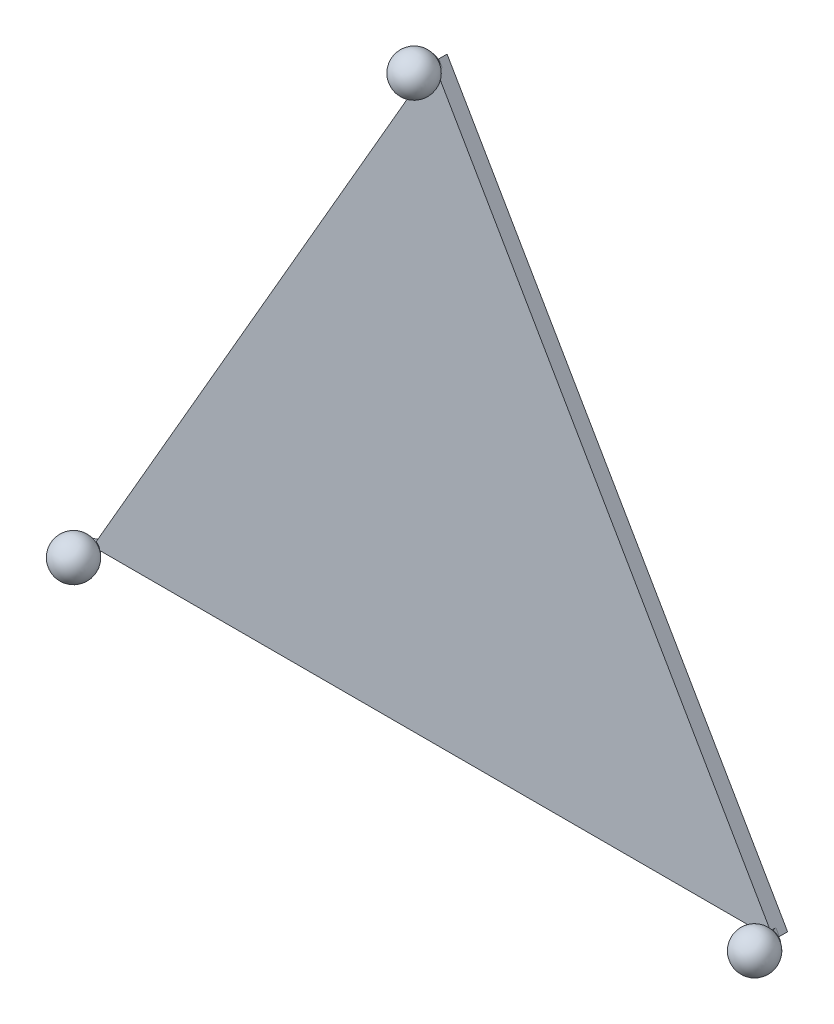
ISO-10303-21;
HEADER;
FILE_DESCRIPTION(('STEP AP214'),'2;1');
FILE_NAME('part.step','',(''),(''),'','','');
FILE_SCHEMA(('AUTOMOTIVE_DESIGN { 1 0 10303 214 1 1 1 1 }'));
ENDSEC;
DATA;
#1=APPLICATION_CONTEXT('core data for automotive mechanical design processes');
#2=APPLICATION_PROTOCOL_DEFINITION('international standard','automotive_design',2000,#1);
#3=PRODUCT_CONTEXT('',#1,'mechanical');
#4=PRODUCT('Part','Part','',(#3));
#5=PRODUCT_RELATED_PRODUCT_CATEGORY('part','',(#4));
#6=PRODUCT_DEFINITION_FORMATION('','',#4);
#7=PRODUCT_DEFINITION_CONTEXT('part definition',#1,'design');
#8=PRODUCT_DEFINITION('design','',#6,#7);
#9=PRODUCT_DEFINITION_SHAPE('','',#8);
#10=(LENGTH_UNIT() NAMED_UNIT(*) SI_UNIT(.MILLI.,.METRE.));
#11=(NAMED_UNIT(*) PLANE_ANGLE_UNIT() SI_UNIT($,.RADIAN.));
#12=(NAMED_UNIT(*) SI_UNIT($,.STERADIAN.) SOLID_ANGLE_UNIT());
#13=UNCERTAINTY_MEASURE_WITH_UNIT(LENGTH_MEASURE(1.E-05),#10,'distance_accuracy_value','');
#14=(GEOMETRIC_REPRESENTATION_CONTEXT(3) GLOBAL_UNCERTAINTY_ASSIGNED_CONTEXT((#13)) GLOBAL_UNIT_ASSIGNED_CONTEXT((#10,
#11,#12)) REPRESENTATION_CONTEXT('',''));
#15=CARTESIAN_POINT('',(0.,0.,0.));
#16=DIRECTION('',(0.,0.,1.));
#17=DIRECTION('',(1.,0.,0.));
#18=AXIS2_PLACEMENT_3D('',#15,#16,#17);
#19=CARTESIAN_POINT('',(-123.7575,-71.4514259392352,5.));
#20=DIRECTION('',(0.,0.,1.));
#21=DIRECTION('',(1.,0.,0.));
#22=AXIS2_PLACEMENT_3D('',#19,#20,#21);
#23=PLANE('',#22);
#24=CARTESIAN_POINT('',(-123.7575,-71.4514259392352,5.));
#25=DIRECTION('',(0.,0.,1.));
#26=DIRECTION('',(1.,0.,0.));
#27=AXIS2_PLACEMENT_3D('',#24,#25,#26);
#28=CIRCLE('',#27,2.5);
#29=CARTESIAN_POINT('',(-124.739550807569,-69.1523878335585,5.));
#30=VERTEX_POINT('',#29);
#31=CARTESIAN_POINT('',(-126.239550807569,-71.7504640449118,5.));
#32=VERTEX_POINT('',#31);
#33=EDGE_CURVE('E379',#30,#32,#28,.T.);
#34=ORIENTED_EDGE('',*,*,#33,.F.);
#35=DIRECTION('',(-0.5,-0.866025403784439,0.));
#36=VECTOR('',#35,1.);
#37=CARTESIAN_POINT('',(-125.489550807569,-70.4514259392352,5.));
#38=LINE('',#37,#36);
#39=EDGE_CURVE('E289',#30,#32,#38,.T.);
#40=ORIENTED_EDGE('',*,*,#39,.T.);
#41=EDGE_LOOP('',(#34,#40));
#42=FACE_BOUND('',#41,.T.);
#43=ADVANCED_FACE('F33',(#42),#23,.F.);
#44=CARTESIAN_POINT('',(0.,142.90285187847,5.));
#45=DIRECTION('',(0.,0.,1.));
#46=DIRECTION('',(1.,0.,0.));
#47=AXIS2_PLACEMENT_3D('',#44,#45,#46);
#48=PLANE('',#47);
#49=CARTESIAN_POINT('',(0.,142.90285187847,5.));
#50=DIRECTION('',(0.,0.,1.));
#51=DIRECTION('',(1.,0.,0.));
#52=AXIS2_PLACEMENT_3D('',#49,#50,#51);
#53=CIRCLE('',#52,2.5);
#54=CARTESIAN_POINT('',(2.48205080756888,142.603813772794,5.));
#55=VERTEX_POINT('',#54);
#56=CARTESIAN_POINT('',(0.982050807568891,145.201889984147,5.));
#57=VERTEX_POINT('',#56);
#58=EDGE_CURVE('E384',#55,#57,#53,.T.);
#59=ORIENTED_EDGE('',*,*,#58,.F.);
#60=DIRECTION('',(-0.5,0.866025403784439,0.));
#61=VECTOR('',#60,1.);
#62=CARTESIAN_POINT('',(1.73205080756889,143.90285187847,5.));
#63=LINE('',#62,#61);
#64=EDGE_CURVE('E271',#55,#57,#63,.T.);
#65=ORIENTED_EDGE('',*,*,#64,.T.);
#66=EDGE_LOOP('',(#59,#65));
#67=FACE_BOUND('',#66,.T.);
#68=ADVANCED_FACE('F397',(#67),#48,.F.);
#69=CARTESIAN_POINT('',(123.7575,-71.451425939235,5.));
#70=DIRECTION('',(0.,0.,1.));
#71=DIRECTION('',(1.,0.,0.));
#72=AXIS2_PLACEMENT_3D('',#69,#70,#71);
#73=PLANE('',#72);
#74=CARTESIAN_POINT('',(123.7575,-71.451425939235,5.));
#75=DIRECTION('',(0.,0.,1.));
#76=DIRECTION('',(1.,0.,0.));
#77=AXIS2_PLACEMENT_3D('',#74,#75,#76);
#78=CIRCLE('',#77,2.5);
#79=CARTESIAN_POINT('',(126.239550807569,-71.7504640449117,5.));
#80=VERTEX_POINT('',#79);
#81=CARTESIAN_POINT('',(124.739550807569,-69.1523878335584,5.));
#82=VERTEX_POINT('',#81);
#83=EDGE_CURVE('E176',#80,#82,#78,.T.);
#84=ORIENTED_EDGE('',*,*,#83,.F.);
#85=DIRECTION('',(-0.5,0.866025403784439,0.));
#86=VECTOR('',#85,1.);
#87=CARTESIAN_POINT('',(124.239550807569,-68.2863624297739,5.));
#88=LINE('',#87,#86);
#89=EDGE_CURVE('E213',#80,#82,#88,.T.);
#90=ORIENTED_EDGE('',*,*,#89,.T.);
#91=EDGE_LOOP('',(#84,#90));
#92=FACE_BOUND('',#91,.T.);
#93=ADVANCED_FACE('F352',(#92),#73,.F.);
#94=CARTESIAN_POINT('',(-123.7575,-71.4514259392352,12.));
#95=DIRECTION('',(0.,0.,-1.));
#96=DIRECTION('',(-1.,0.,0.));
#97=AXIS2_PLACEMENT_3D('',#94,#95,#96);
#98=CYLINDRICAL_SURFACE('',#97,2.5);
#99=CARTESIAN_POINT('',(-121.2575,-71.4514259392352,5.));
#100=VERTEX_POINT('',#99);
#101=CARTESIAN_POINT('',(-122.5075,-69.2863624297741,5.));
#102=VERTEX_POINT('',#101);
#103=EDGE_CURVE('E179',#100,#102,#28,.T.);
#104=ORIENTED_EDGE('',*,*,#103,.T.);
#105=DIRECTION('',(0.,0.,-1.));
#106=VECTOR('',#105,1.);
#107=CARTESIAN_POINT('',(-122.5075,-69.2863624297741,3.));
#108=LINE('',#107,#106);
#109=CARTESIAN_POINT('',(-122.5075,-69.2863624297741,3.));
#110=VERTEX_POINT('',#109);
#111=EDGE_CURVE('E279',#110,#102,#108,.F.);
#112=ORIENTED_EDGE('',*,*,#111,.F.);
#113=CARTESIAN_POINT('',(-122.5075,-69.2863624297741,3.));
#114=CARTESIAN_POINT('',(-122.507502372517,-69.2863769555669,3.05588403656606));
#115=CARTESIAN_POINT('',(-122.509528639529,-69.2851916023864,3.11176548566042));
#116=CARTESIAN_POINT('',(-122.517644088464,-69.2805281048706,3.22313523949123));
#117=CARTESIAN_POINT('',(-122.523733185758,-69.2770500082925,3.27862355239221));
#118=CARTESIAN_POINT('',(-122.539996250077,-69.2679041414412,3.38886772437637));
#119=CARTESIAN_POINT('',(-122.550173645324,-69.2622345336382,3.44362292879691));
#120=CARTESIAN_POINT('',(-122.574630446917,-69.2489247868919,3.55194850490367));
#121=CARTESIAN_POINT('',(-122.588909801746,-69.2412846726967,3.60551889146111));
#122=CARTESIAN_POINT('',(-122.637985752196,-69.2157891418292,3.76397748741582));
#123=CARTESIAN_POINT('',(-122.679020686936,-69.1953582514509,3.86661627898835));
#124=CARTESIAN_POINT('',(-122.777804146591,-69.1507497225796,4.06251910254597));
#125=CARTESIAN_POINT('',(-122.835542141817,-69.1265744490111,4.15578899098132));
#126=CARTESIAN_POINT('',(-122.965741389441,-69.0791315030096,4.32782556063514));
#127=CARTESIAN_POINT('',(-123.037784967359,-69.0558564946555,4.40690400183181));
#128=CARTESIAN_POINT('',(-123.196052560385,-69.0139194696452,4.55077275841782));
#129=CARTESIAN_POINT('',(-123.282262858282,-68.9952530339732,4.61557675464437));
#130=CARTESIAN_POINT('',(-123.457225707296,-68.968098926337,4.72386822073222));
#131=CARTESIAN_POINT('',(-123.544970194945,-68.9588167847305,4.7687903938855));
#132=CARTESIAN_POINT('',(-123.726487305243,-68.9499699107095,4.84543297300334));
#133=CARTESIAN_POINT('',(-123.82025954495,-68.9504045615959,4.87715421666572));
#134=CARTESIAN_POINT('',(-124.007015255951,-68.9622074400778,4.92760063246216));
#135=CARTESIAN_POINT('',(-124.099914901075,-68.9731990508979,4.94673531936629));
#136=CARTESIAN_POINT('',(-124.285279517758,-69.0059589222181,4.97557177633407));
#137=CARTESIAN_POINT('',(-124.377744323751,-69.0277309973485,4.98527020380542));
#138=CARTESIAN_POINT('',(-124.514832841465,-69.0684103717226,4.99444482364722));
#139=CARTESIAN_POINT('',(-124.560501720431,-69.0834095960974,4.99660437855715));
#140=CARTESIAN_POINT('',(-124.650807204182,-69.1159822722996,4.99937848060133));
#141=CARTESIAN_POINT('',(-124.695446486527,-69.1335478953882,4.99999762668175));
#142=CARTESIAN_POINT('',(-124.739550807569,-69.1523878335585,5.));
#143=B_SPLINE_CURVE_WITH_KNOTS('',3,(#113,#114,#115,#116,#117,#118,#119,#120,#121,#122,#123,
#124,#125,#126,#127,#128,#129,#130,#131,#132,#133,#134,#135,#136,#137,#138,#139,#140,#141,#142),
.UNSPECIFIED.,.F.,.F.,(4,2,2,2,2,2,2,2,2,2,2,2,2,2,4),(0.,0.167598122599439,0.335192754301002,
0.502928216005738,0.670661571184178,1.00611882844509,1.34136507095177,1.66797367045537,
1.9942678681735,2.28976294947502,2.58523927654074,2.87055155785856,3.15596486817093,
3.30022943936492,3.44406278382534),.UNSPECIFIED.);
#144=EDGE_CURVE('E341',#110,#30,#143,.T.);
#145=ORIENTED_EDGE('',*,*,#144,.T.);
#146=ORIENTED_EDGE('',*,*,#33,.T.);
#147=CARTESIAN_POINT('',(-126.239550807569,-71.7504640449118,5.));
#148=CARTESIAN_POINT('',(-126.232885801471,-71.8058523917289,4.99999887194513));
#149=CARTESIAN_POINT('',(-126.224348699682,-71.8610332367092,4.99915970321356));
#150=CARTESIAN_POINT('',(-126.203611932703,-71.9706985062084,4.9953402154349));
#151=CARTESIAN_POINT('',(-126.191407547556,-72.0251819383393,4.99235713014409));
#152=CARTESIAN_POINT('',(-126.163750714742,-72.1318108864693,4.98387895649168));
#153=CARTESIAN_POINT('',(-126.148377655114,-72.1839814194399,4.9784419876939));
#154=CARTESIAN_POINT('',(-126.114411533937,-72.2868302211369,4.96465931667628));
#155=CARTESIAN_POINT('',(-126.095820898307,-72.337509580705,4.95631580110629));
#156=CARTESIAN_POINT('',(-126.053662345479,-72.4419326105632,4.93533161233909));
#157=CARTESIAN_POINT('',(-126.02978403492,-72.4954837474448,4.92234760242297));
#158=CARTESIAN_POINT('',(-125.97859656698,-72.6004326916885,4.89178571989344));
#159=CARTESIAN_POINT('',(-125.951248219393,-72.6517951711771,4.87415239910366));
#160=CARTESIAN_POINT('',(-125.922563509461,-72.7014259392352,4.85404962177391));
#161=B_SPLINE_CURVE_WITH_KNOTS('',3,(#147,#148,#149,#150,#151,#152,#153,#154,#155,#156,#157,
#158,#159,#160),.UNSPECIFIED.,.F.,.F.,(4,2,2,2,2,2,4),(0.,0.167353259543859,0.334922839513673,
0.498716448858257,0.662387098359596,0.842242147624125,1.02434764500822),.UNSPECIFIED.);
#162=CARTESIAN_POINT('',(-125.922563509461,-72.7014259392352,4.85404962177391));
#163=VERTEX_POINT('',#162);
#164=EDGE_CURVE('E336',#32,#163,#161,.T.);
#165=ORIENTED_EDGE('',*,*,#164,.T.);
#166=CARTESIAN_POINT('',(-125.922563509461,-72.7014259392352,4.85404962177391));
#167=CARTESIAN_POINT('',(-125.896257181107,-72.7470275447044,4.87250792774471));
#168=CARTESIAN_POINT('',(-125.868127163757,-72.7923881599997,4.88888858880041));
#169=CARTESIAN_POINT('',(-125.808430325192,-72.8820046821869,4.91780136698697));
#170=CARTESIAN_POINT('',(-125.776866574805,-72.9262615333402,4.93033688516197));
#171=CARTESIAN_POINT('',(-125.71115689676,-73.0122262719688,4.95167323971567));
#172=CARTESIAN_POINT('',(-125.677078428964,-73.053968047809,4.96054641231471));
#173=CARTESIAN_POINT('',(-125.606015976743,-73.1354419922948,4.97531445249955));
#174=CARTESIAN_POINT('',(-125.569032263539,-73.1751743479629,4.98120959771963));
#175=CARTESIAN_POINT('',(-125.488486656683,-73.256216866482,4.99091084474348));
#176=CARTESIAN_POINT('',(-125.444638563179,-73.2972746172433,4.9944425446464));
#177=CARTESIAN_POINT('',(-125.353491392318,-73.3766591446701,4.99900166778408));
#178=CARTESIAN_POINT('',(-125.306157697185,-73.414947976549,4.999999047114));
#179=CARTESIAN_POINT('',(-125.2575,-73.4514259392352,5.));
#180=B_SPLINE_CURVE_WITH_KNOTS('',3,(#166,#167,#168,#169,#170,#171,#172,#173,#174,#175,#176,
#177,#178,#179),.UNSPECIFIED.,.F.,.F.,(4,2,2,2,2,2,4),(0.,0.167259804527393,0.334371237632237,
0.498002685249131,0.661618875085864,0.841923239354755,1.02435531262011),.UNSPECIFIED.);
#181=CARTESIAN_POINT('',(-125.2575,-73.4514259392352,5.));
#182=VERTEX_POINT('',#181);
#183=EDGE_CURVE('E11',#163,#182,#180,.T.);
#184=ORIENTED_EDGE('',*,*,#183,.T.);
#185=CARTESIAN_POINT('',(-122.2575,-73.4514259392352,5.));
#186=VERTEX_POINT('',#185);
#187=EDGE_CURVE('E173',#182,#186,#28,.T.);
#188=ORIENTED_EDGE('',*,*,#187,.T.);
#189=CARTESIAN_POINT('',(-122.2575,-73.4514259392352,5.));
#190=CARTESIAN_POINT('',(-122.213582425451,-73.4184972992361,4.9999989880182));
#191=CARTESIAN_POINT('',(-122.170745613056,-73.3841006291168,4.99918654533846));
#192=CARTESIAN_POINT('',(-122.087440583672,-73.3125835908463,4.99549678545797));
#193=CARTESIAN_POINT('',(-122.046974509804,-73.2754608246075,4.9926176301999));
#194=CARTESIAN_POINT('',(-121.968484292214,-73.1985549413592,4.98432838670015));
#195=CARTESIAN_POINT('',(-121.930474623368,-73.1587584559305,4.97890462125029));
#196=CARTESIAN_POINT('',(-121.857403786671,-73.0770447654949,4.96508398050666));
#197=CARTESIAN_POINT('',(-121.822341774488,-73.0351281733236,4.95668796020695));
#198=CARTESIAN_POINT('',(-121.755172204204,-72.9493148446754,4.93645026441548));
#199=CARTESIAN_POINT('',(-121.723085625256,-72.9054068849963,4.92458625973779));
#200=CARTESIAN_POINT('',(-121.662325119296,-72.8163973843116,4.89707915546116));
#201=CARTESIAN_POINT('',(-121.633652424166,-72.7712954195888,4.8814346978391));
#202=CARTESIAN_POINT('',(-121.579980231639,-72.6807208373796,4.84617526831111));
#203=CARTESIAN_POINT('',(-121.554966607505,-72.6352504013969,4.82657630122359));
#204=CARTESIAN_POINT('',(-121.50852061799,-72.5444488639168,4.78323603140356));
#205=CARTESIAN_POINT('',(-121.487089372008,-72.4991178102998,4.75949343861683));
#206=CARTESIAN_POINT('',(-121.432749440515,-72.3749942289746,4.68807749329315));
#207=CARTESIAN_POINT('',(-121.403555657033,-72.2970534967245,4.63596461253028));
#208=CARTESIAN_POINT('',(-121.355060161249,-72.1474888821883,4.51946158053621));
#209=CARTESIAN_POINT('',(-121.33576963584,-72.0758722189314,4.45505765724233));
#210=CARTESIAN_POINT('',(-121.305418612102,-71.9432056177502,4.31691824458123));
#211=CARTESIAN_POINT('',(-121.294211074032,-71.8819832476347,4.24337959546015));
#212=CARTESIAN_POINT('',(-121.277297049086,-71.7704605644365,4.08789632248275));
#213=CARTESIAN_POINT('',(-121.271591685757,-71.7201624837228,4.00594998555089));
#214=CARTESIAN_POINT('',(-121.263250873096,-71.6277177217304,3.82769535230318));
#215=CARTESIAN_POINT('',(-121.260947395087,-71.5867519719067,3.73075957408743));
#216=CARTESIAN_POINT('',(-121.258233894667,-71.5205391490936,3.53166608583528));
#217=CARTESIAN_POINT('',(-121.257822892841,-71.4952839512597,3.42951110458394));
#218=CARTESIAN_POINT('',(-121.257549589035,-71.4692752229752,3.2721664138521));
#219=CARTESIAN_POINT('',(-121.257518827987,-71.4625801101057,3.21789675752764));
#220=CARTESIAN_POINT('',(-121.257499090986,-71.45365935649,3.1090917650397));
#221=CARTESIAN_POINT('',(-121.25751003831,-71.4514255207588,3.05455710081585));
#222=CARTESIAN_POINT('',(-121.2575,-71.4514259392352,3.));
#223=B_SPLINE_CURVE_WITH_KNOTS('',3,(#189,#190,#191,#192,#193,#194,#195,#196,#197,#198,#199,
#200,#201,#202,#203,#204,#205,#206,#207,#208,#209,#210,#211,#212,#213,#214,#215,#216,#217,#218,
#219,#220,#221,#222),.UNSPECIFIED.,.F.,.F.,(4,2,2,2,2,2,2,2,2,2,2,2,2,2,2,2,4),(0.,
0.164662168674353,0.329470963490528,0.495175931602967,0.660833271971879,0.827581645569142,
0.994390008183195,1.16053633282053,1.32673447714334,1.61970720157852,1.91301014889442,
2.2008328645135,2.48871434122556,2.80316815907457,3.11745921898777,3.2813415833631,
3.44492263192548),.UNSPECIFIED.);
#224=CARTESIAN_POINT('',(-121.2575,-71.4514259392352,3.));
#225=VERTEX_POINT('',#224);
#226=EDGE_CURVE('E43',#186,#225,#223,.T.);
#227=ORIENTED_EDGE('',*,*,#226,.T.);
#228=DIRECTION('',(0.,0.,-1.));
#229=VECTOR('',#228,1.);
#230=CARTESIAN_POINT('',(-121.2575,-71.4514259392352,5.));
#231=LINE('',#230,#229);
#232=EDGE_CURVE('E51',#100,#225,#231,.T.);
#233=ORIENTED_EDGE('',*,*,#232,.F.);
#234=EDGE_LOOP('',(#104,#112,#145,#146,#165,#184,#188,#227,#233));
#235=FACE_BOUND('',#234,.T.);
#236=CARTESIAN_POINT('',(-123.7575,-71.4514259392352,5.46165158468898));
#237=DIRECTION('',(0.,0.,1.));
#238=DIRECTION('',(1.,0.,0.));
#239=AXIS2_PLACEMENT_3D('',#236,#237,#238);
#240=CIRCLE('',#239,2.5);
#241=CARTESIAN_POINT('',(-121.2575,-71.4514259392352,5.46165158468898));
#242=VERTEX_POINT('',#241);
#243=EDGE_CURVE('E208',#242,#242,#240,.T.);
#244=ORIENTED_EDGE('',*,*,#243,.F.);
#245=EDGE_LOOP('',(#244));
#246=FACE_BOUND('',#245,.T.);
#247=ADVANCED_FACE('F349',(#235,#246),#98,.T.);
#248=CARTESIAN_POINT('',(123.7575,-71.451425939235,12.));
#249=DIRECTION('',(0.,0.,-1.));
#250=DIRECTION('',(-1.,0.,0.));
#251=AXIS2_PLACEMENT_3D('',#248,#249,#250);
#252=CYLINDRICAL_SURFACE('',#251,2.5);
#253=CARTESIAN_POINT('',(122.5075,-69.2863624297739,5.));
#254=VERTEX_POINT('',#253);
#255=CARTESIAN_POINT('',(121.2575,-71.451425939235,5.));
#256=VERTEX_POINT('',#255);
#257=EDGE_CURVE('E166',#254,#256,#78,.T.);
#258=ORIENTED_EDGE('',*,*,#257,.T.);
#259=DIRECTION('',(0.,0.,-1.));
#260=VECTOR('',#259,1.);
#261=CARTESIAN_POINT('',(121.2575,-71.451425939235,3.));
#262=LINE('',#261,#260);
#263=CARTESIAN_POINT('',(121.2575,-71.451425939235,3.));
#264=VERTEX_POINT('',#263);
#265=EDGE_CURVE('E152',#264,#256,#262,.F.);
#266=ORIENTED_EDGE('',*,*,#265,.F.);
#267=CARTESIAN_POINT('',(121.2575,-71.451425939235,3.));
#268=CARTESIAN_POINT('',(121.257513765964,-71.4514207309986,3.05588403656606));
#269=CARTESIAN_POINT('',(121.257500353503,-71.4537682062964,3.11176548566042));
#270=CARTESIAN_POINT('',(121.257519370652,-71.4631281399945,3.22313523949122));
#271=CARTESIAN_POINT('',(121.257551799305,-71.4701405012268,3.27862355239221));
#272=CARTESIAN_POINT('',(121.257762778432,-71.4887976614961,3.38886772437636));
#273=CARTESIAN_POINT('',(121.257941451668,-71.5004463482255,3.44362292879691));
#274=CARTESIAN_POINT('',(121.258643273665,-71.5282814330734,3.55194850490367));
#275=CARTESIAN_POINT('',(121.259166418098,-71.5444677742027,3.60551889146111));
#276=CARTESIAN_POINT('',(121.261624615909,-71.5997165594415,3.76397748741582));
#277=CARTESIAN_POINT('',(121.264448413189,-71.6454693005574,3.86661627898834));
#278=CARTESIAN_POINT('',(121.275208023789,-71.7533225505282,4.06251910254597));
#279=CARTESIAN_POINT('',(121.283140620348,-71.8154127579418,4.15578899098131));
#280=CARTESIAN_POINT('',(121.307153447693,-71.9518900869387,4.32782556063513));
#281=CARTESIAN_POINT('',(121.323018488144,-72.0259191597723,4.4069040018318));
#282=CARTESIAN_POINT('',(121.365833755639,-72.1839514284333,4.55077275841781));
#283=CARTESIAN_POINT('',(121.392773297097,-72.2679449543161,4.61557675464437));
#284=CARTESIAN_POINT('',(121.456738574574,-72.4330442800991,4.72386822073222));
#285=CARTESIAN_POINT('',(121.492572247966,-72.5136743062483,4.76879039388549));
#286=CARTESIAN_POINT('',(121.575669185468,-72.6752961719983,4.84543297300333));
#287=CARTESIAN_POINT('',(121.622931724031,-72.7562879883111,4.87715421666571));
#288=CARTESIAN_POINT('',(121.726531172135,-72.9121217390988,4.92760063246216));
#289=CARTESIAN_POINT('',(121.782500008896,-72.9870793863686,4.94673531936629));
#290=CARTESIAN_POINT('',(121.903553198025,-73.1312299177191,4.97557177633407));
#291=CARTESIAN_POINT('',(121.968640771178,-73.2004207511001,4.98527020380542));
#292=CARTESIAN_POINT('',(122.072414401653,-73.2988032028199,4.99444482364722));
#293=CARTESIAN_POINT('',(122.108238550482,-73.33085399998,4.99660437855715));
#294=CARTESIAN_POINT('',(122.181600057417,-73.392774504908,4.99937848060133));
#295=CARTESIAN_POINT('',(122.219131974418,-73.4226504458813,4.99999762668175));
#296=CARTESIAN_POINT('',(122.2575,-73.451425939235,5.));
#297=B_SPLINE_CURVE_WITH_KNOTS('',3,(#267,#268,#269,#270,#271,#272,#273,#274,#275,#276,#277,
#278,#279,#280,#281,#282,#283,#284,#285,#286,#287,#288,#289,#290,#291,#292,#293,#294,#295,#296),
.UNSPECIFIED.,.F.,.F.,(4,2,2,2,2,2,2,2,2,2,2,2,2,2,4),(0.,0.167598122599437,0.335192754301,
0.502928216005731,0.670661571184175,1.00611882844509,1.34136507095175,1.66797367045535,
1.9942678681735,2.28976294947501,2.58523927654073,2.87055155785858,3.15596486817092,
3.30022943936489,3.44406278382533),.UNSPECIFIED.);
#298=CARTESIAN_POINT('',(122.2575,-73.451425939235,5.));
#299=VERTEX_POINT('',#298);
#300=EDGE_CURVE('E260',#264,#299,#297,.T.);
#301=ORIENTED_EDGE('',*,*,#300,.T.);
#302=CARTESIAN_POINT('',(125.2575,-73.451425939235,5.));
#303=VERTEX_POINT('',#302);
#304=EDGE_CURVE('E174',#299,#303,#78,.T.);
#305=ORIENTED_EDGE('',*,*,#304,.T.);
#306=CARTESIAN_POINT('',(125.2575,-73.451425939235,5.));
#307=CARTESIAN_POINT('',(125.302135212368,-73.4179597012292,4.99999887194513));
#308=CARTESIAN_POINT('',(125.345654675029,-73.3829759317149,4.99915970321356));
#309=CARTESIAN_POINT('',(125.430259200839,-73.3101847299692,4.9953402154349));
#310=CARTESIAN_POINT('',(125.471341044576,-73.2723737063292,4.99235713014409));
#311=CARTESIAN_POINT('',(125.549856006028,-73.1951077124591,4.98387895649168));
#312=CARTESIAN_POINT('',(125.587350483096,-73.1557089858018,4.9784419876939));
#313=CARTESIAN_POINT('',(125.659437097526,-73.0748690611461,4.96465931667628));
#314=CARTESIAN_POINT('',(125.694031392544,-73.0334294186339,4.95631580110629));
#315=CARTESIAN_POINT('',(125.763385112728,-72.9447075259691,4.93533161233909));
#316=CARTESIAN_POINT('',(125.797822602389,-72.8972527339851,4.92234760242297));
#317=CARTESIAN_POINT('',(125.863117320234,-72.8004486142714,4.89178571989344));
#318=CARTESIAN_POINT('',(125.893924358479,-72.751083010765,4.87415239910366));
#319=CARTESIAN_POINT('',(125.922563509461,-72.701425939235,4.85404962177391));
#320=B_SPLINE_CURVE_WITH_KNOTS('',3,(#306,#307,#308,#309,#310,#311,#312,#313,#314,#315,#316,
#317,#318,#319),.UNSPECIFIED.,.F.,.F.,(4,2,2,2,2,2,4),(0.,0.167353259543853,0.334922839513669,
0.498716448858264,0.662387098359582,0.842242147624125,1.0243476450082),.UNSPECIFIED.);
#321=CARTESIAN_POINT('',(125.922563509461,-72.701425939235,4.85404962177391));
#322=VERTEX_POINT('',#321);
#323=EDGE_CURVE('E255',#303,#322,#320,.T.);
#324=ORIENTED_EDGE('',*,*,#323,.T.);
#325=CARTESIAN_POINT('',(125.922563509461,-72.701425939235,4.85404962177391));
#326=CARTESIAN_POINT('',(125.948902494074,-72.6558431878658,4.87250792774471));
#327=CARTESIAN_POINT('',(125.974120930576,-72.6088015705836,4.88888858880041));
#328=CARTESIAN_POINT('',(126.021882696106,-72.5122943307674,4.91780136698697));
#329=CARTESIAN_POINT('',(126.044428378303,-72.4628308955165,4.93033688516197));
#330=CARTESIAN_POINT('',(126.086021186763,-72.3629422757412,4.95167323971567));
#331=CARTESIAN_POINT('',(126.105131391141,-72.3125585689879,4.96054641231471));
#332=CARTESIAN_POINT('',(126.140158670702,-72.2102797078664,4.97531445249955));
#333=CARTESIAN_POINT('',(126.156076043461,-72.1583846948711,4.98120959771963));
#334=CARTESIAN_POINT('',(126.185988119857,-72.0481088939105,4.99091084474348));
#335=CARTESIAN_POINT('',(126.199621128286,-71.9896064556483,4.9944425446464));
#336=CARTESIAN_POINT('',(126.222796560275,-71.8709784264862,4.99900166778408));
#337=CARTESIAN_POINT('',(126.232288813797,-71.8108418281069,4.999999047114));
#338=CARTESIAN_POINT('',(126.239550807569,-71.7504640449117,5.));
#339=B_SPLINE_CURVE_WITH_KNOTS('',3,(#325,#326,#327,#328,#329,#330,#331,#332,#333,#334,#335,
#336,#337,#338),.UNSPECIFIED.,.F.,.F.,(4,2,2,2,2,2,4),(0.,0.167259804527405,0.334371237632263,
0.498002685249157,0.661618875085899,0.841923239354761,1.0243553126201),.UNSPECIFIED.);
#340=EDGE_CURVE('E227',#322,#80,#339,.T.);
#341=ORIENTED_EDGE('',*,*,#340,.T.);
#342=ORIENTED_EDGE('',*,*,#83,.T.);
#343=CARTESIAN_POINT('',(124.739550807569,-69.1523878335584,5.));
#344=CARTESIAN_POINT('',(124.689074981543,-69.130818418326,4.9999989880182));
#345=CARTESIAN_POINT('',(124.637868185217,-69.1109189856341,4.99918654533846));
#346=CARTESIAN_POINT('',(124.534280098579,-69.0745332330596,4.99549678545797));
#347=CARTESIAN_POINT('',(124.481897803024,-69.0580499682184,4.99261763019989));
#348=CARTESIAN_POINT('',(124.376050245635,-69.0285283874606,4.98432838670015));
#349=CARTESIAN_POINT('',(124.322580643849,-69.0155092913649,4.97890462125028));
#350=CARTESIAN_POINT('',(124.215279093747,-68.9930849357276,4.96508398050666));
#351=CARTESIAN_POINT('',(124.161447253994,-68.9836786385546,4.95668796020694));
#352=CARTESIAN_POINT('',(124.05354594626,-68.968414748652,4.93645026441547));
#353=CARTESIAN_POINT('',(123.999477248275,-68.9625809360016,4.92458625973777));
#354=CARTESIAN_POINT('',(123.892012506525,-68.9544655446363,4.89707915546114));
#355=CARTESIAN_POINT('',(123.838616711749,-68.9521852446199,4.88143469783908));
#356=CARTESIAN_POINT('',(123.733340726355,-68.9509910535197,4.84617526831109));
#357=CARTESIAN_POINT('',(123.681455361606,-68.9520638375703,4.82657630122356));
#358=CARTESIAN_POINT('',(123.579595928688,-68.9572411994863,4.78323603140353));
#359=CARTESIAN_POINT('',(123.529622461684,-68.9613467228392,4.7594934386168));
#360=CARTESIAN_POINT('',(123.394958321302,-68.9763487523896,4.68807749329311));
#361=CARTESIAN_POINT('',(123.312862775442,-68.9900365603865,4.63596461253024));
#362=CARTESIAN_POINT('',(123.159088271855,-69.0228205363363,4.51946158053618));
#363=CARTESIAN_POINT('',(123.087421159435,-69.0419227829079,4.4550576572423));
#364=CARTESIAN_POINT('',(122.95735300071,-69.0819713259111,4.31691824458121));
#365=CARTESIAN_POINT('',(122.898729103875,-69.1028764982858,4.24337959546012));
#366=CARTESIAN_POINT('',(122.793690614654,-69.1439898646014,4.08789632248271));
#367=CARTESIAN_POINT('',(122.74727851733,-69.1641979153776,4.00594998555084));
#368=CARTESIAN_POINT('',(122.663048598667,-69.2031969407216,3.82769535230312));
#369=CARTESIAN_POINT('',(122.62641947963,-69.2216849451605,3.73075957408738));
#370=CARTESIAN_POINT('',(122.567720742808,-69.2524413962701,3.53166608583522));
#371=CARTESIAN_POINT('',(122.545643598993,-69.2647130571646,3.42951110458388));
#372=CARTESIAN_POINT('',(122.522982727676,-69.2774807332682,3.27216641385204));
#373=CARTESIAN_POINT('',(122.517169209326,-69.280801649854,3.21789675752759));
#374=CARTESIAN_POINT('',(122.509433741573,-69.2852449339172,3.10909176503968));
#375=CARTESIAN_POINT('',(122.507504656744,-69.2863713324435,3.05455710081584));
#376=CARTESIAN_POINT('',(122.5075,-69.2863624297739,3.));
#377=B_SPLINE_CURVE_WITH_KNOTS('',3,(#343,#344,#345,#346,#347,#348,#349,#350,#351,#352,#353,
#354,#355,#356,#357,#358,#359,#360,#361,#362,#363,#364,#365,#366,#367,#368,#369,#370,#371,#372,
#373,#374,#375,#376),.UNSPECIFIED.,.F.,.F.,(4,2,2,2,2,2,2,2,2,2,2,2,2,2,2,2,4),(0.,
0.164662168674366,0.329470963490528,0.49517593160299,0.660833271971912,0.827581645569201,
0.994390008183251,1.1605363328206,1.3267344771434,1.61970720157857,1.91301014889445,
2.20083286451354,2.48871434122561,2.80316815907462,3.11745921898783,3.28134158336313,
3.44492263192547),.UNSPECIFIED.);
#378=CARTESIAN_POINT('',(122.5075,-69.2863624297739,3.));
#379=VERTEX_POINT('',#378);
#380=EDGE_CURVE('E220',#82,#379,#377,.T.);
#381=ORIENTED_EDGE('',*,*,#380,.T.);
#382=DIRECTION('',(0.,0.,-1.));
#383=VECTOR('',#382,1.);
#384=CARTESIAN_POINT('',(122.5075,-69.2863624297739,5.));
#385=LINE('',#384,#383);
#386=EDGE_CURVE('E163',#254,#379,#385,.T.);
#387=ORIENTED_EDGE('',*,*,#386,.F.);
#388=EDGE_LOOP('',(#258,#266,#301,#305,#324,#341,#342,#381,#387));
#389=FACE_BOUND('',#388,.T.);
#390=CARTESIAN_POINT('',(123.7575,-71.451425939235,5.46165158468898));
#391=DIRECTION('',(0.,0.,1.));
#392=DIRECTION('',(1.,0.,0.));
#393=AXIS2_PLACEMENT_3D('',#390,#391,#392);
#394=CIRCLE('',#393,2.5);
#395=CARTESIAN_POINT('',(126.2575,-71.451425939235,5.46165158468898));
#396=VERTEX_POINT('',#395);
#397=EDGE_CURVE('E205',#396,#396,#394,.T.);
#398=ORIENTED_EDGE('',*,*,#397,.F.);
#399=EDGE_LOOP('',(#398));
#400=FACE_BOUND('',#399,.T.);
#401=ADVANCED_FACE('F167',(#389,#400),#252,.T.);
#402=CARTESIAN_POINT('',(0.,142.90285187847,12.));
#403=DIRECTION('',(0.,0.,-1.));
#404=DIRECTION('',(-1.,0.,0.));
#405=AXIS2_PLACEMENT_3D('',#402,#403,#404);
#406=CYLINDRICAL_SURFACE('',#405,2.5);
#407=CARTESIAN_POINT('',(-1.25,140.737788369009,5.));
#408=VERTEX_POINT('',#407);
#409=CARTESIAN_POINT('',(1.24999999999999,140.737788369009,5.));
#410=VERTEX_POINT('',#409);
#411=EDGE_CURVE('E193',#408,#410,#53,.T.);
#412=ORIENTED_EDGE('',*,*,#411,.T.);
#413=DIRECTION('',(0.,0.,-1.));
#414=VECTOR('',#413,1.);
#415=CARTESIAN_POINT('',(1.25,140.737788369009,3.));
#416=LINE('',#415,#414);
#417=CARTESIAN_POINT('',(1.25,140.737788369009,3.));
#418=VERTEX_POINT('',#417);
#419=EDGE_CURVE('E274',#418,#410,#416,.F.);
#420=ORIENTED_EDGE('',*,*,#419,.F.);
#421=CARTESIAN_POINT('',(1.25,140.737788369009,3.));
#422=CARTESIAN_POINT('',(1.2499886065529,140.737797686565,3.05588403656606));
#423=CARTESIAN_POINT('',(1.25202828602589,140.738959808683,3.11176548566042));
#424=CARTESIAN_POINT('',(1.26012471781212,140.743656244865,3.22313523949122));
#425=CARTESIAN_POINT('',(1.26618138645296,140.747190509519,3.27862355239221));
#426=CARTESIAN_POINT('',(1.28223347164526,140.756701802937,3.38886772437637));
#427=CARTESIAN_POINT('',(1.29223219365545,140.762680881864,3.44362292879691));
#428=CARTESIAN_POINT('',(1.31598717325214,140.777206219965,3.55194850490367));
#429=CARTESIAN_POINT('',(1.32974338364759,140.785752446899,3.60551889146111));
#430=CARTESIAN_POINT('',(1.37636113628706,140.815505701271,3.76397748741582));
#431=CARTESIAN_POINT('',(1.4145722737462,140.840827552008,3.86661627898835));
#432=CARTESIAN_POINT('',(1.50259612280179,140.904072273108,4.06251910254598));
#433=CARTESIAN_POINT('',(1.55240152146863,140.941987206953,4.15578899098132));
#434=CARTESIAN_POINT('',(1.65858794174833,141.031021589948,4.32782556063514));
#435=CARTESIAN_POINT('',(1.71476647921535,141.081775654428,4.40690400183181));
#436=CARTESIAN_POINT('',(1.83021880474611,141.197870898079,4.55077275841782));
#437=CARTESIAN_POINT('',(1.88948956118479,141.263197988289,4.61557675464437));
#438=CARTESIAN_POINT('',(2.00048713272197,141.401143206436,4.72386822073223));
#439=CARTESIAN_POINT('',(2.05239794697916,141.472491090979,4.76879039388551));
#440=CARTESIAN_POINT('',(2.15081811977438,141.625266082708,4.84543297300334));
#441=CARTESIAN_POINT('',(2.19732782091841,141.706692549907,4.87715421666572));
#442=CARTESIAN_POINT('',(2.2804840838158,141.874329179177,4.92760063246216));
#443=CARTESIAN_POINT('',(2.31741489217906,141.960278437266,4.94673531936629));
#444=CARTESIAN_POINT('',(2.38172631973275,142.137188839937,4.97557177633407));
#445=CARTESIAN_POINT('',(2.4091035525734,142.228151748449,4.98527020380542));
#446=CARTESIAN_POINT('',(2.442418439812,142.367213574542,4.99444482364722));
#447=CARTESIAN_POINT('',(2.45226316994964,142.414263596077,4.99660437855715));
#448=CARTESIAN_POINT('',(2.46920714676463,142.508756777208,4.99937848060133));
#449=CARTESIAN_POINT('',(2.47631451210918,142.556198341269,4.99999762668175));
#450=CARTESIAN_POINT('',(2.48205080756888,142.603813772794,5.));
#451=B_SPLINE_CURVE_WITH_KNOTS('',3,(#421,#422,#423,#424,#425,#426,#427,#428,#429,#430,#431,
#432,#433,#434,#435,#436,#437,#438,#439,#440,#441,#442,#443,#444,#445,#446,#447,#448,#449,#450),
.UNSPECIFIED.,.F.,.F.,(4,2,2,2,2,2,2,2,2,2,2,2,2,2,4),(0.,0.167598122599438,0.335192754301001,
0.502928216005736,0.670661571184179,1.00611882844509,1.34136507095176,1.66797367045537,
1.9942678681735,2.28976294947507,2.58523927654075,2.87055155785863,3.15596486817094,
3.3002294393649,3.44406278382534),.UNSPECIFIED.);
#452=EDGE_CURVE('E301',#418,#55,#451,.T.);
#453=ORIENTED_EDGE('',*,*,#452,.T.);
#454=ORIENTED_EDGE('',*,*,#58,.T.);
#455=CARTESIAN_POINT('',(0.982050807568891,145.201889984147,5.));
#456=CARTESIAN_POINT('',(0.93075058910262,145.223812092958,4.99999887194513));
#457=CARTESIAN_POINT('',(0.878694024652839,145.244009168424,4.99915970321356));
#458=CARTESIAN_POINT('',(0.773352731864193,145.280883236178,4.9953402154349));
#459=CARTESIAN_POINT('',(0.720066502980158,145.297555644669,4.99235713014408));
#460=CARTESIAN_POINT('',(0.613894708713786,145.326918598928,4.98387895649168));
#461=CARTESIAN_POINT('',(0.561027172018051,145.339690405242,4.9784419876939));
#462=CARTESIAN_POINT('',(0.454974436411265,145.361699282283,4.96465931667628));
#463=CARTESIAN_POINT('',(0.401789505762719,145.370938999339,4.95631580110628));
#464=CARTESIAN_POINT('',(0.290277232751475,145.386640136532,4.93533161233909));
#465=CARTESIAN_POINT('',(0.231961432531151,145.39273648143,4.92234760242297));
#466=CARTESIAN_POINT('',(0.115479246745552,145.40088130596,4.89178571989344));
#467=CARTESIAN_POINT('',(0.0573238609134215,145.402878181942,4.87415239910366));
#468=CARTESIAN_POINT('',(0.,145.40285187847,4.85404962177391));
#469=B_SPLINE_CURVE_WITH_KNOTS('',3,(#455,#456,#457,#458,#459,#460,#461,#462,#463,#464,#465,
#466,#467,#468),.UNSPECIFIED.,.F.,.F.,(4,2,2,2,2,2,4),(0.,0.167353259543875,0.334922839513692,
0.498716448858297,0.662387098359632,0.842242147624131,1.0243476450082),.UNSPECIFIED.);
#470=CARTESIAN_POINT('',(0.,145.40285187847,4.85404962177391));
#471=VERTEX_POINT('',#470);
#472=EDGE_CURVE('E295',#57,#471,#469,.T.);
#473=ORIENTED_EDGE('',*,*,#472,.T.);
#474=CARTESIAN_POINT('',(0.,145.40285187847,4.85404962177392));
#475=CARTESIAN_POINT('',(-0.0526453129665657,145.40287073257,4.8725079277447));
#476=CARTESIAN_POINT('',(-0.10599376681889,145.401189730583,4.8888885888004));
#477=CARTESIAN_POINT('',(-0.213452370914123,145.394299012954,4.91780136698696));
#478=CARTESIAN_POINT('',(-0.267561803498109,145.389092428857,4.93033688516197));
#479=CARTESIAN_POINT('',(-0.374864290002444,145.37516854771,4.95167323971567));
#480=CARTESIAN_POINT('',(-0.428052962177005,145.366526616797,4.96054641231471));
#481=CARTESIAN_POINT('',(-0.534142693958679,145.345721700161,4.97531445249955));
#482=CARTESIAN_POINT('',(-0.587043779921712,145.333559042834,4.98120959771963));
#483=CARTESIAN_POINT('',(-0.697501463174191,145.304325760393,4.99091084474347));
#484=CARTESIAN_POINT('',(-0.754982565107496,145.286881072892,4.9944425446464));
#485=CARTESIAN_POINT('',(-0.869305167956995,145.247637571156,4.99900166778408));
#486=CARTESIAN_POINT('',(-0.926131116611705,145.225789804656,4.999999047114));
#487=CARTESIAN_POINT('',(-0.982050807568877,145.201889984147,5.));
#488=B_SPLINE_CURVE_WITH_KNOTS('',3,(#474,#475,#476,#477,#478,#479,#480,#481,#482,#483,#484,
#485,#486,#487),.UNSPECIFIED.,.F.,.F.,(4,2,2,2,2,2,4),(0.,0.167259804527366,0.334371237632235,
0.498002685249128,0.661618875085867,0.841923239354735,1.02435531262009),.UNSPECIFIED.);
#489=CARTESIAN_POINT('',(-0.982050807568877,145.201889984147,5.));
#490=VERTEX_POINT('',#489);
#491=EDGE_CURVE('E322',#471,#490,#488,.T.);
#492=ORIENTED_EDGE('',*,*,#491,.T.);
#493=CARTESIAN_POINT('',(-2.48205080756888,142.603813772794,5.));
#494=VERTEX_POINT('',#493);
#495=EDGE_CURVE('E382',#490,#494,#53,.T.);
#496=ORIENTED_EDGE('',*,*,#495,.T.);
#497=CARTESIAN_POINT('',(-2.48205080756888,142.603813772794,5.));
#498=CARTESIAN_POINT('',(-2.47549255609202,142.549315717562,4.9999989880182));
#499=CARTESIAN_POINT('',(-2.46712257216083,142.495019614751,4.99918654533846));
#500=CARTESIAN_POINT('',(-2.4468395149073,142.387116823906,4.99549678545797));
#501=CARTESIAN_POINT('',(-2.43492329321943,142.333510792826,4.9926176301999));
#502=CARTESIAN_POINT('',(-2.40756595342118,142.22708332882,4.98432838670015));
#503=CARTESIAN_POINT('',(-2.39210602048153,142.174267747295,4.97890462125028));
#504=CARTESIAN_POINT('',(-2.35787530707572,142.070129701222,4.96508398050666));
#505=CARTESIAN_POINT('',(-2.33910547950697,142.018806811878,4.95668796020694));
#506=CARTESIAN_POINT('',(-2.29837374205603,141.917729593327,4.93645026441547));
#507=CARTESIAN_POINT('',(-2.27639162301982,141.867987820998,4.92458625973778));
#508=CARTESIAN_POINT('',(-2.22968738722848,141.770862928948,4.89707915546115));
#509=CARTESIAN_POINT('',(-2.20496428758303,141.723480664209,4.8814346978391));
#510=CARTESIAN_POINT('',(-2.15336049471601,141.631711890899,4.84617526831111));
#511=CARTESIAN_POINT('',(-2.12648875410085,141.587314238967,4.82657630122358));
#512=CARTESIAN_POINT('',(-2.07107531069794,141.501690063403,4.78323603140356));
#513=CARTESIAN_POINT('',(-2.04253308967657,141.460464533139,4.75949343861682));
#514=CARTESIAN_POINT('',(-1.96220888078636,141.351342981364,4.68807749329314));
#515=CARTESIAN_POINT('',(-1.90930711840935,141.287090057111,4.63596461253027));
#516=CARTESIAN_POINT('',(-1.8040281106059,141.170309418524,4.51946158053621));
#517=CARTESIAN_POINT('',(-1.75165152359577,141.117795001839,4.45505765724233));
#518=CARTESIAN_POINT('',(-1.65193438860782,141.025176943661,4.31691824458125));
#519=CARTESIAN_POINT('',(-1.60451802984317,140.98485974592,4.24337959546016));
#520=CARTESIAN_POINT('',(-1.51639356556842,140.914450429038,4.08789632248275));
#521=CARTESIAN_POINT('',(-1.47568683157316,140.8843603991,4.00594998555088));
#522=CARTESIAN_POINT('',(-1.39979772557118,140.830914662452,3.82769535230316));
#523=CARTESIAN_POINT('',(-1.36547208454337,140.808436917067,3.73075957408743));
#524=CARTESIAN_POINT('',(-1.30948684814094,140.772980545364,3.53166608583527));
#525=CARTESIAN_POINT('',(-1.28782070615224,140.759997008424,3.42951110458394));
#526=CARTESIAN_POINT('',(-1.26543313864065,140.746755956243,3.27216641385209));
#527=CARTESIAN_POINT('',(-1.25965038133842,140.74338175996,3.21789675752763));
#528=CARTESIAN_POINT('',(-1.25193465058701,140.738904290407,3.1090917650397));
#529=CARTESIAN_POINT('',(-1.2499946184339,140.737796853202,3.05455710081585));
#530=CARTESIAN_POINT('',(-1.25,140.737788369009,3.));
#531=B_SPLINE_CURVE_WITH_KNOTS('',3,(#497,#498,#499,#500,#501,#502,#503,#504,#505,#506,#507,
#508,#509,#510,#511,#512,#513,#514,#515,#516,#517,#518,#519,#520,#521,#522,#523,#524,#525,#526,
#527,#528,#529,#530),.UNSPECIFIED.,.F.,.F.,(4,2,2,2,2,2,2,2,2,2,2,2,2,2,2,2,4),(0.,
0.164662168674377,0.329470963490508,0.495175931603022,0.660833271971877,0.827581645569161,
0.994390008183183,1.16053633282053,1.32673447714334,1.61970720157852,1.91301014889439,
2.20083286451348,2.48871434122556,2.80316815907456,3.11745921898776,3.28134158336309,
3.44492263192546),.UNSPECIFIED.);
#532=CARTESIAN_POINT('',(-1.25,140.737788369009,3.));
#533=VERTEX_POINT('',#532);
#534=EDGE_CURVE('E318',#494,#533,#531,.T.);
#535=ORIENTED_EDGE('',*,*,#534,.T.);
#536=DIRECTION('',(0.,0.,-1.));
#537=VECTOR('',#536,1.);
#538=CARTESIAN_POINT('',(-1.25,140.737788369009,5.));
#539=LINE('',#538,#537);
#540=EDGE_CURVE('E59',#408,#533,#539,.T.);
#541=ORIENTED_EDGE('',*,*,#540,.F.);
#542=EDGE_LOOP('',(#412,#420,#453,#454,#473,#492,#496,#535,#541));
#543=FACE_BOUND('',#542,.T.);
#544=CARTESIAN_POINT('',(0.,142.90285187847,5.46165158468898));
#545=DIRECTION('',(0.,0.,1.));
#546=DIRECTION('',(1.,0.,0.));
#547=AXIS2_PLACEMENT_3D('',#544,#545,#546);
#548=CIRCLE('',#547,2.5);
#549=CARTESIAN_POINT('',(2.5,142.90285187847,5.46165158468898));
#550=VERTEX_POINT('',#549);
#551=EDGE_CURVE('E202',#550,#550,#548,.T.);
#552=ORIENTED_EDGE('',*,*,#551,.F.);
#553=EDGE_LOOP('',(#552));
#554=FACE_BOUND('',#553,.T.);
#555=ADVANCED_FACE('F306',(#543,#554),#406,.T.);
#556=CARTESIAN_POINT('',(123.7575,-71.451425939235,5.));
#557=DIRECTION('',(-0.866025403784438,-0.5,0.));
#558=DIRECTION('',(0.5,-0.866025403784439,0.));
#559=AXIS2_PLACEMENT_3D('',#556,#557,#558);
#560=PLANE('',#559);
#561=DIRECTION('',(0.,0.,-1.));
#562=VECTOR('',#561,1.);
#563=CARTESIAN_POINT('',(0.,142.90285187847,5.));
#564=LINE('',#563,#562);
#565=CARTESIAN_POINT('',(0.,142.90285187847,3.));
#566=VERTEX_POINT('',#565);
#567=CARTESIAN_POINT('',(0.,142.90285187847,0.));
#568=VERTEX_POINT('',#567);
#569=EDGE_CURVE('E200',#566,#568,#564,.T.);
#570=ORIENTED_EDGE('',*,*,#569,.F.);
#571=DIRECTION('',(-0.5,0.866025403784439,0.));
#572=VECTOR('',#571,1.);
#573=CARTESIAN_POINT('',(1.25000000000001,140.737788369009,3.));
#574=LINE('',#573,#572);
#575=EDGE_CURVE('E276',#566,#418,#574,.F.);
#576=ORIENTED_EDGE('',*,*,#575,.T.);
#577=ORIENTED_EDGE('',*,*,#419,.T.);
#578=DIRECTION('',(-0.5,0.866025403784438,0.));
#579=VECTOR('',#578,1.);
#580=CARTESIAN_POINT('',(123.7575,-71.451425939235,5.));
#581=LINE('',#580,#579);
#582=EDGE_CURVE('E185',#254,#410,#581,.T.);
#583=ORIENTED_EDGE('',*,*,#582,.F.);
#584=ORIENTED_EDGE('',*,*,#386,.T.);
#585=DIRECTION('',(-0.5,0.866025403784439,0.));
#586=VECTOR('',#585,1.);
#587=CARTESIAN_POINT('',(123.7575,-71.451425939235,3.));
#588=LINE('',#587,#586);
#589=CARTESIAN_POINT('',(123.7575,-71.451425939235,3.));
#590=VERTEX_POINT('',#589);
#591=EDGE_CURVE('E216',#379,#590,#588,.F.);
#592=ORIENTED_EDGE('',*,*,#591,.T.);
#593=DIRECTION('',(0.,0.,-1.));
#594=VECTOR('',#593,1.);
#595=CARTESIAN_POINT('',(123.7575,-71.451425939235,5.));
#596=LINE('',#595,#594);
#597=CARTESIAN_POINT('',(123.7575,-71.451425939235,0.));
#598=VERTEX_POINT('',#597);
#599=EDGE_CURVE('E180',#590,#598,#596,.T.);
#600=ORIENTED_EDGE('',*,*,#599,.T.);
#601=DIRECTION('',(-0.5,0.866025403784438,0.));
#602=VECTOR('',#601,1.);
#603=CARTESIAN_POINT('',(123.7575,-71.451425939235,0.));
#604=LINE('',#603,#602);
#605=EDGE_CURVE('E189',#598,#568,#604,.T.);
#606=ORIENTED_EDGE('',*,*,#605,.T.);
#607=EDGE_LOOP('',(#570,#576,#577,#583,#584,#592,#600,#606));
#608=FACE_BOUND('',#607,.T.);
#609=ADVANCED_FACE('F243',(#608),#560,.F.);
#610=CARTESIAN_POINT('',(0.,142.90285187847,5.));
#611=DIRECTION('',(0.866025403784439,-0.5,0.));
#612=DIRECTION('',(0.5,0.866025403784439,0.));
#613=AXIS2_PLACEMENT_3D('',#610,#611,#612);
#614=PLANE('',#613);
#615=DIRECTION('',(-0.5,-0.866025403784439,0.));
#616=VECTOR('',#615,1.);
#617=CARTESIAN_POINT('',(0.,142.90285187847,5.));
#618=LINE('',#617,#616);
#619=EDGE_CURVE('E181',#408,#102,#618,.T.);
#620=ORIENTED_EDGE('',*,*,#619,.F.);
#621=ORIENTED_EDGE('',*,*,#540,.T.);
#622=DIRECTION('',(-0.5,-0.866025403784439,0.));
#623=VECTOR('',#622,1.);
#624=CARTESIAN_POINT('',(0.,142.90285187847,3.));
#625=LINE('',#624,#623);
#626=EDGE_CURVE('E284',#533,#566,#625,.F.);
#627=ORIENTED_EDGE('',*,*,#626,.T.);
#628=ORIENTED_EDGE('',*,*,#569,.T.);
#629=DIRECTION('',(-0.5,-0.866025403784439,0.));
#630=VECTOR('',#629,1.);
#631=CARTESIAN_POINT('',(0.,142.90285187847,0.));
#632=LINE('',#631,#630);
#633=CARTESIAN_POINT('',(-123.7575,-71.4514259392352,0.));
#634=VERTEX_POINT('',#633);
#635=EDGE_CURVE('E192',#568,#634,#632,.T.);
#636=ORIENTED_EDGE('',*,*,#635,.T.);
#637=DIRECTION('',(0.,0.,-1.));
#638=VECTOR('',#637,1.);
#639=CARTESIAN_POINT('',(-123.7575,-71.4514259392352,5.));
#640=LINE('',#639,#638);
#641=CARTESIAN_POINT('',(-123.7575,-71.4514259392352,3.));
#642=VERTEX_POINT('',#641);
#643=EDGE_CURVE('E183',#642,#634,#640,.T.);
#644=ORIENTED_EDGE('',*,*,#643,.F.);
#645=DIRECTION('',(-0.5,-0.866025403784439,0.));
#646=VECTOR('',#645,1.);
#647=CARTESIAN_POINT('',(-122.5075,-69.2863624297741,3.));
#648=LINE('',#647,#646);
#649=EDGE_CURVE('E281',#642,#110,#648,.F.);
#650=ORIENTED_EDGE('',*,*,#649,.T.);
#651=ORIENTED_EDGE('',*,*,#111,.T.);
#652=EDGE_LOOP('',(#620,#621,#627,#628,#636,#644,#650,#651));
#653=FACE_BOUND('',#652,.T.);
#654=ADVANCED_FACE('F418',(#653),#614,.F.);
#655=CARTESIAN_POINT('',(-123.7575,-71.4514259392352,5.));
#656=DIRECTION('',(0.,1.,0.));
#657=DIRECTION('',(-1.,0.,0.));
#658=AXIS2_PLACEMENT_3D('',#655,#656,#657);
#659=PLANE('',#658);
#660=DIRECTION('',(1.,0.,0.));
#661=VECTOR('',#660,1.);
#662=CARTESIAN_POINT('',(-123.7575,-71.4514259392352,5.));
#663=LINE('',#662,#661);
#664=EDGE_CURVE('E156',#100,#256,#663,.T.);
#665=ORIENTED_EDGE('',*,*,#664,.F.);
#666=ORIENTED_EDGE('',*,*,#232,.T.);
#667=DIRECTION('',(1.,0.,0.));
#668=VECTOR('',#667,1.);
#669=CARTESIAN_POINT('',(-123.7575,-71.4514259392352,3.));
#670=LINE('',#669,#668);
#671=EDGE_CURVE('E292',#225,#642,#670,.F.);
#672=ORIENTED_EDGE('',*,*,#671,.T.);
#673=ORIENTED_EDGE('',*,*,#643,.T.);
#674=DIRECTION('',(1.,0.,0.));
#675=VECTOR('',#674,1.);
#676=CARTESIAN_POINT('',(-123.7575,-71.4514259392352,0.));
#677=LINE('',#676,#675);
#678=EDGE_CURVE('E196',#634,#598,#677,.T.);
#679=ORIENTED_EDGE('',*,*,#678,.T.);
#680=ORIENTED_EDGE('',*,*,#599,.F.);
#681=DIRECTION('',(1.,0.,0.));
#682=VECTOR('',#681,1.);
#683=CARTESIAN_POINT('',(121.2575,-71.451425939235,3.));
#684=LINE('',#683,#682);
#685=EDGE_CURVE('E160',#590,#264,#684,.F.);
#686=ORIENTED_EDGE('',*,*,#685,.T.);
#687=ORIENTED_EDGE('',*,*,#265,.T.);
#688=EDGE_LOOP('',(#665,#666,#672,#673,#679,#680,#686,#687));
#689=FACE_BOUND('',#688,.T.);
#690=ADVANCED_FACE('F154',(#689),#659,.F.);
#691=CARTESIAN_POINT('',(0.,0.,5.));
#692=DIRECTION('',(0.,0.,1.));
#693=DIRECTION('',(1.,0.,0.));
#694=AXIS2_PLACEMENT_3D('',#691,#692,#693);
#695=PLANE('',#694);
#696=ORIENTED_EDGE('',*,*,#664,.T.);
#697=ORIENTED_EDGE('',*,*,#257,.F.);
#698=ORIENTED_EDGE('',*,*,#582,.T.);
#699=ORIENTED_EDGE('',*,*,#411,.F.);
#700=ORIENTED_EDGE('',*,*,#619,.T.);
#701=ORIENTED_EDGE('',*,*,#103,.F.);
#702=EDGE_LOOP('',(#696,#697,#698,#699,#700,#701));
#703=FACE_BOUND('',#702,.T.);
#704=ADVANCED_FACE('F177',(#703),#695,.T.);
#705=CARTESIAN_POINT('',(0.,0.,0.));
#706=DIRECTION('',(0.,0.,1.));
#707=DIRECTION('',(1.,0.,0.));
#708=AXIS2_PLACEMENT_3D('',#705,#706,#707);
#709=PLANE('',#708);
#710=ORIENTED_EDGE('',*,*,#605,.F.);
#711=ORIENTED_EDGE('',*,*,#678,.F.);
#712=ORIENTED_EDGE('',*,*,#635,.F.);
#713=EDGE_LOOP('',(#710,#711,#712));
#714=FACE_BOUND('',#713,.T.);
#715=ADVANCED_FACE('F407',(#714),#709,.F.);
#716=ORIENTED_EDGE('',*,*,#495,.F.);
#717=DIRECTION('',(-0.5,-0.866025403784439,0.));
#718=VECTOR('',#717,1.);
#719=CARTESIAN_POINT('',(-2.98205080756888,141.737788369009,5.));
#720=LINE('',#719,#718);
#721=EDGE_CURVE('E265',#490,#494,#720,.T.);
#722=ORIENTED_EDGE('',*,*,#721,.T.);
#723=EDGE_LOOP('',(#716,#722));
#724=FACE_BOUND('',#723,.T.);
#725=ADVANCED_FACE('F311',(#724),#48,.F.);
#726=ORIENTED_EDGE('',*,*,#187,.F.);
#727=DIRECTION('',(1.,0.,0.));
#728=VECTOR('',#727,1.);
#729=CARTESIAN_POINT('',(-121.2575,-73.4514259392352,5.));
#730=LINE('',#729,#728);
#731=EDGE_CURVE('E287',#182,#186,#730,.T.);
#732=ORIENTED_EDGE('',*,*,#731,.T.);
#733=EDGE_LOOP('',(#726,#732));
#734=FACE_BOUND('',#733,.T.);
#735=ADVANCED_FACE('F353',(#734),#23,.F.);
#736=ORIENTED_EDGE('',*,*,#304,.F.);
#737=DIRECTION('',(1.,0.,0.));
#738=VECTOR('',#737,1.);
#739=CARTESIAN_POINT('',(123.7575,-73.451425939235,5.));
#740=LINE('',#739,#738);
#741=EDGE_CURVE('E211',#299,#303,#740,.T.);
#742=ORIENTED_EDGE('',*,*,#741,.T.);
#743=EDGE_LOOP('',(#736,#742));
#744=FACE_BOUND('',#743,.T.);
#745=ADVANCED_FACE('F404',(#744),#73,.F.);
#746=CARTESIAN_POINT('',(0.,142.90285187847,12.));
#747=DIRECTION('',(0.,1.,0.));
#748=DIRECTION('',(1.,0.,0.));
#749=AXIS2_PLACEMENT_3D('',#746,#747,#748);
#750=SPHERICAL_SURFACE('',#749,7.00000000000001);
#751=CARTESIAN_POINT('',(0.,142.90285187847,12.));
#752=DIRECTION('',(0.,0.,1.));
#753=DIRECTION('',(1.,0.,0.));
#754=AXIS2_PLACEMENT_3D('',#751,#752,#753);
#755=SPHERICAL_SURFACE('',#754,7.00000000000001);
#756=ORIENTED_EDGE('',*,*,#551,.T.);
#757=EDGE_LOOP('',(#756));
#758=FACE_BOUND('',#757,.T.);
#759=ADVANCED_FACE('F435',(#758),#755,.T.);
#760=CARTESIAN_POINT('',(123.7575,-71.451425939235,12.));
#761=DIRECTION('',(0.,1.,0.));
#762=DIRECTION('',(1.,0.,0.));
#763=AXIS2_PLACEMENT_3D('',#760,#761,#762);
#764=SPHERICAL_SURFACE('',#763,7.00000000000001);
#765=CARTESIAN_POINT('',(123.7575,-71.451425939235,12.));
#766=DIRECTION('',(0.,0.,1.));
#767=DIRECTION('',(1.,0.,0.));
#768=AXIS2_PLACEMENT_3D('',#765,#766,#767);
#769=SPHERICAL_SURFACE('',#768,7.00000000000001);
#770=ORIENTED_EDGE('',*,*,#397,.T.);
#771=EDGE_LOOP('',(#770));
#772=FACE_BOUND('',#771,.T.);
#773=ADVANCED_FACE('F439',(#772),#769,.T.);
#774=CARTESIAN_POINT('',(-123.7575,-71.4514259392352,12.));
#775=DIRECTION('',(0.,1.,0.));
#776=DIRECTION('',(1.,0.,0.));
#777=AXIS2_PLACEMENT_3D('',#774,#775,#776);
#778=SPHERICAL_SURFACE('',#777,7.00000000000001);
#779=CARTESIAN_POINT('',(-123.7575,-71.4514259392352,12.));
#780=DIRECTION('',(0.,0.,1.));
#781=DIRECTION('',(1.,0.,0.));
#782=AXIS2_PLACEMENT_3D('',#779,#780,#781);
#783=SPHERICAL_SURFACE('',#782,7.00000000000001);
#784=ORIENTED_EDGE('',*,*,#243,.T.);
#785=EDGE_LOOP('',(#784));
#786=FACE_BOUND('',#785,.T.);
#787=ADVANCED_FACE('F249',(#786),#783,.T.);
#788=CARTESIAN_POINT('',(123.7575,-73.451425939235,3.));
#789=DIRECTION('',(-1.,0.,0.));
#790=DIRECTION('',(0.,-1.,0.));
#791=AXIS2_PLACEMENT_3D('',#788,#789,#790);
#792=CYLINDRICAL_SURFACE('',#791,2.);
#793=ORIENTED_EDGE('',*,*,#300,.F.);
#794=ORIENTED_EDGE('',*,*,#685,.F.);
#795=CARTESIAN_POINT('',(127.221601615138,-73.451425939235,3.));
#796=DIRECTION('',(-0.499999999999999,-0.866025403784439,0.));
#797=DIRECTION('',(0.866025403784439,-0.5,0.));
#798=AXIS2_PLACEMENT_3D('',#795,#796,#797);
#799=ELLIPSE('',#798,4.,2.);
#800=EDGE_CURVE('E266',#322,#590,#799,.T.);
#801=ORIENTED_EDGE('',*,*,#800,.F.);
#802=ORIENTED_EDGE('',*,*,#323,.F.);
#803=ORIENTED_EDGE('',*,*,#741,.F.);
#804=EDGE_LOOP('',(#793,#794,#801,#802,#803));
#805=FACE_BOUND('',#804,.T.);
#806=ADVANCED_FACE('F241',(#805),#792,.F.);
#807=CARTESIAN_POINT('',(125.489550807569,-70.451425939235,3.));
#808=DIRECTION('',(0.5,-0.866025403784439,0.));
#809=DIRECTION('',(0.866025403784438,0.5,0.));
#810=AXIS2_PLACEMENT_3D('',#807,#808,#809);
#811=CYLINDRICAL_SURFACE('',#810,2.);
#812=ORIENTED_EDGE('',*,*,#800,.T.);
#813=ORIENTED_EDGE('',*,*,#591,.F.);
#814=ORIENTED_EDGE('',*,*,#380,.F.);
#815=ORIENTED_EDGE('',*,*,#89,.F.);
#816=ORIENTED_EDGE('',*,*,#340,.F.);
#817=EDGE_LOOP('',(#812,#813,#814,#815,#816));
#818=FACE_BOUND('',#817,.T.);
#819=ADVANCED_FACE('F235',(#818),#811,.F.);
#820=CARTESIAN_POINT('',(-1.73205080756888,143.90285187847,3.));
#821=DIRECTION('',(0.5,0.866025403784439,0.));
#822=DIRECTION('',(-0.866025403784439,0.5,0.));
#823=AXIS2_PLACEMENT_3D('',#820,#821,#822);
#824=CYLINDRICAL_SURFACE('',#823,2.);
#825=ORIENTED_EDGE('',*,*,#721,.F.);
#826=ORIENTED_EDGE('',*,*,#491,.F.);
#827=CARTESIAN_POINT('',(0.,146.90285187847,3.));
#828=DIRECTION('',(1.,0.,0.));
#829=DIRECTION('',(0.,-1.,0.));
#830=AXIS2_PLACEMENT_3D('',#827,#828,#829);
#831=ELLIPSE('',#830,4.,2.);
#832=EDGE_CURVE('E269',#566,#471,#831,.F.);
#833=ORIENTED_EDGE('',*,*,#832,.F.);
#834=ORIENTED_EDGE('',*,*,#626,.F.);
#835=ORIENTED_EDGE('',*,*,#534,.F.);
#836=EDGE_LOOP('',(#825,#826,#833,#834,#835));
#837=FACE_BOUND('',#836,.T.);
#838=ADVANCED_FACE('F240',(#837),#824,.F.);
#839=CARTESIAN_POINT('',(1.73205080756889,143.90285187847,3.));
#840=DIRECTION('',(0.5,-0.866025403784439,0.));
#841=DIRECTION('',(0.866025403784438,0.5,0.));
#842=AXIS2_PLACEMENT_3D('',#839,#840,#841);
#843=CYLINDRICAL_SURFACE('',#842,2.);
#844=ORIENTED_EDGE('',*,*,#452,.F.);
#845=ORIENTED_EDGE('',*,*,#575,.F.);
#846=ORIENTED_EDGE('',*,*,#832,.T.);
#847=ORIENTED_EDGE('',*,*,#472,.F.);
#848=ORIENTED_EDGE('',*,*,#64,.F.);
#849=EDGE_LOOP('',(#844,#845,#846,#847,#848));
#850=FACE_BOUND('',#849,.T.);
#851=ADVANCED_FACE('F251',(#850),#843,.F.);
#852=CARTESIAN_POINT('',(-123.7575,-73.4514259392352,3.));
#853=DIRECTION('',(-1.,0.,0.));
#854=DIRECTION('',(0.,-1.,0.));
#855=AXIS2_PLACEMENT_3D('',#852,#853,#854);
#856=CYLINDRICAL_SURFACE('',#855,2.);
#857=ORIENTED_EDGE('',*,*,#731,.F.);
#858=ORIENTED_EDGE('',*,*,#183,.F.);
#859=CARTESIAN_POINT('',(-127.221601615138,-73.4514259392352,3.));
#860=DIRECTION('',(-0.5,0.866025403784439,0.));
#861=DIRECTION('',(0.866025403784438,0.5,0.));
#862=AXIS2_PLACEMENT_3D('',#859,#860,#861);
#863=ELLIPSE('',#862,4.,2.);
#864=EDGE_CURVE('E38',#642,#163,#863,.F.);
#865=ORIENTED_EDGE('',*,*,#864,.F.);
#866=ORIENTED_EDGE('',*,*,#671,.F.);
#867=ORIENTED_EDGE('',*,*,#226,.F.);
#868=EDGE_LOOP('',(#857,#858,#865,#866,#867));
#869=FACE_BOUND('',#868,.T.);
#870=ADVANCED_FACE('F35',(#869),#856,.F.);
#871=CARTESIAN_POINT('',(-125.489550807569,-70.4514259392352,3.));
#872=DIRECTION('',(0.5,0.866025403784439,0.));
#873=DIRECTION('',(-0.866025403784439,0.5,0.));
#874=AXIS2_PLACEMENT_3D('',#871,#872,#873);
#875=CYLINDRICAL_SURFACE('',#874,2.);
#876=ORIENTED_EDGE('',*,*,#144,.F.);
#877=ORIENTED_EDGE('',*,*,#649,.F.);
#878=ORIENTED_EDGE('',*,*,#864,.T.);
#879=ORIENTED_EDGE('',*,*,#164,.F.);
#880=ORIENTED_EDGE('',*,*,#39,.F.);
#881=EDGE_LOOP('',(#876,#877,#878,#879,#880));
#882=FACE_BOUND('',#881,.T.);
#883=ADVANCED_FACE('F330',(#882),#875,.F.);
#884=CLOSED_SHELL('',(#43,#68,#93,#247,#401,#555,#609,#654,#690,#704,#715,#725,#735,#745,#759,
#773,#787,#806,#819,#838,#851,#870,#883));
#885=MANIFOLD_SOLID_BREP('B2',#884);
#886=ADVANCED_BREP_SHAPE_REPRESENTATION('',(#18,#885),#14);
#887=SHAPE_DEFINITION_REPRESENTATION(#9,#886);
ENDSEC;
END-ISO-10303-21;
